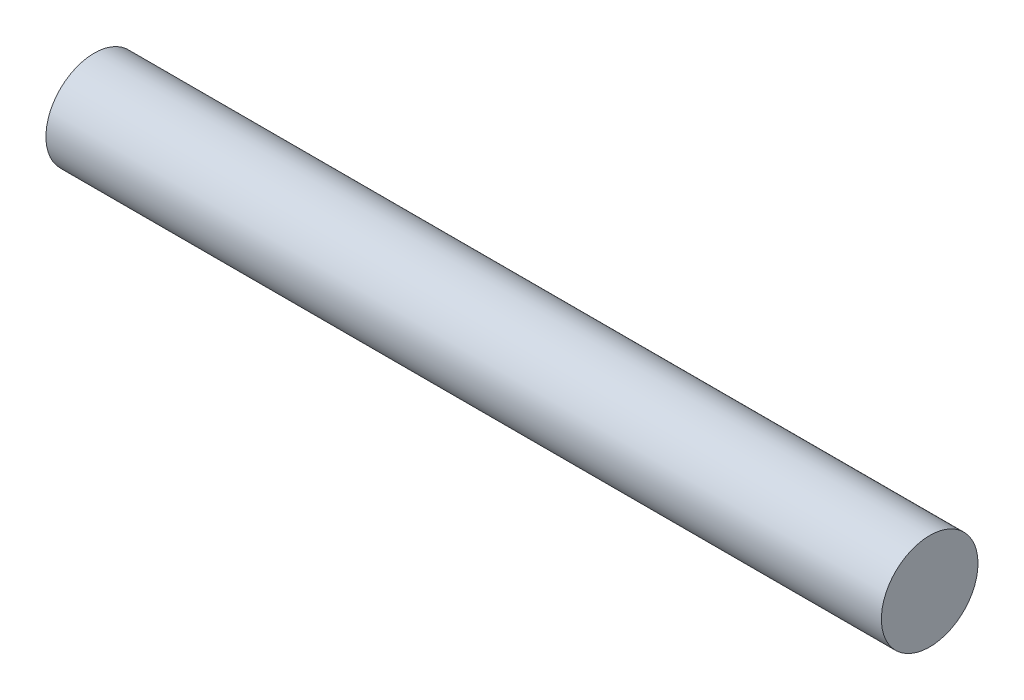
ISO-10303-21;
HEADER;
FILE_DESCRIPTION(('STEP AP214'),'2;1');
FILE_NAME('part.step','',(''),(''),'','','');
FILE_SCHEMA(('AUTOMOTIVE_DESIGN { 1 0 10303 214 1 1 1 1 }'));
ENDSEC;
DATA;
#1=APPLICATION_CONTEXT('core data for automotive mechanical design processes');
#2=APPLICATION_PROTOCOL_DEFINITION('international standard','automotive_design',2000,#1);
#3=PRODUCT_CONTEXT('',#1,'mechanical');
#4=PRODUCT('Part','Part','',(#3));
#5=PRODUCT_RELATED_PRODUCT_CATEGORY('part','',(#4));
#6=PRODUCT_DEFINITION_FORMATION('','',#4);
#7=PRODUCT_DEFINITION_CONTEXT('part definition',#1,'design');
#8=PRODUCT_DEFINITION('design','',#6,#7);
#9=PRODUCT_DEFINITION_SHAPE('','',#8);
#10=(LENGTH_UNIT() NAMED_UNIT(*) SI_UNIT(.MILLI.,.METRE.));
#11=(NAMED_UNIT(*) PLANE_ANGLE_UNIT() SI_UNIT($,.RADIAN.));
#12=(NAMED_UNIT(*) SI_UNIT($,.STERADIAN.) SOLID_ANGLE_UNIT());
#13=UNCERTAINTY_MEASURE_WITH_UNIT(LENGTH_MEASURE(1.E-05),#10,'distance_accuracy_value','');
#14=(GEOMETRIC_REPRESENTATION_CONTEXT(3) GLOBAL_UNCERTAINTY_ASSIGNED_CONTEXT((#13)) GLOBAL_UNIT_ASSIGNED_CONTEXT((#10,
#11,#12)) REPRESENTATION_CONTEXT('',''));
#15=CARTESIAN_POINT('',(0.,0.,0.));
#16=DIRECTION('',(0.,0.,1.));
#17=DIRECTION('',(1.,0.,0.));
#18=AXIS2_PLACEMENT_3D('',#15,#16,#17);
#19=CARTESIAN_POINT('',(16.,0.,0.));
#20=DIRECTION('',(-1.,0.,0.));
#21=DIRECTION('',(0.,0.,1.));
#22=AXIS2_PLACEMENT_3D('',#19,#20,#21);
#23=CYLINDRICAL_SURFACE('',#22,0.925);
#24=CARTESIAN_POINT('',(16.,0.,0.));
#25=DIRECTION('',(1.,0.,0.));
#26=DIRECTION('',(0.,0.,-1.));
#27=AXIS2_PLACEMENT_3D('',#24,#25,#26);
#28=CIRCLE('',#27,0.925);
#29=CARTESIAN_POINT('',(16.,0.,-0.925));
#30=VERTEX_POINT('',#29);
#31=EDGE_CURVE('E10',#30,#30,#28,.T.);
#32=ORIENTED_EDGE('',*,*,#31,.F.);
#33=EDGE_LOOP('',(#32));
#34=FACE_BOUND('',#33,.T.);
#35=CARTESIAN_POINT('',(0.,0.,0.));
#36=DIRECTION('',(1.,0.,0.));
#37=DIRECTION('',(0.,0.,-1.));
#38=AXIS2_PLACEMENT_3D('',#35,#36,#37);
#39=CIRCLE('',#38,0.925);
#40=CARTESIAN_POINT('',(0.,0.,-0.925));
#41=VERTEX_POINT('',#40);
#42=EDGE_CURVE('E40',#41,#41,#39,.T.);
#43=ORIENTED_EDGE('',*,*,#42,.T.);
#44=EDGE_LOOP('',(#43));
#45=FACE_BOUND('',#44,.T.);
#46=ADVANCED_FACE('F37',(#34,#45),#23,.T.);
#47=CARTESIAN_POINT('',(16.,0.,0.));
#48=DIRECTION('',(1.,0.,0.));
#49=DIRECTION('',(0.,0.,-1.));
#50=AXIS2_PLACEMENT_3D('',#47,#48,#49);
#51=PLANE('',#50);
#52=ORIENTED_EDGE('',*,*,#31,.T.);
#53=EDGE_LOOP('',(#52));
#54=FACE_BOUND('',#53,.T.);
#55=ADVANCED_FACE('F54',(#54),#51,.T.);
#56=CARTESIAN_POINT('',(0.,0.,0.));
#57=DIRECTION('',(1.,0.,0.));
#58=DIRECTION('',(0.,0.,-1.));
#59=AXIS2_PLACEMENT_3D('',#56,#57,#58);
#60=PLANE('',#59);
#61=ORIENTED_EDGE('',*,*,#42,.F.);
#62=EDGE_LOOP('',(#61));
#63=FACE_BOUND('',#62,.T.);
#64=ADVANCED_FACE('F52',(#63),#60,.F.);
#65=CLOSED_SHELL('',(#46,#55,#64));
#66=MANIFOLD_SOLID_BREP('B2',#65);
#67=ADVANCED_BREP_SHAPE_REPRESENTATION('',(#18,#66),#14);
#68=SHAPE_DEFINITION_REPRESENTATION(#9,#67);
ENDSEC;
END-ISO-10303-21;
